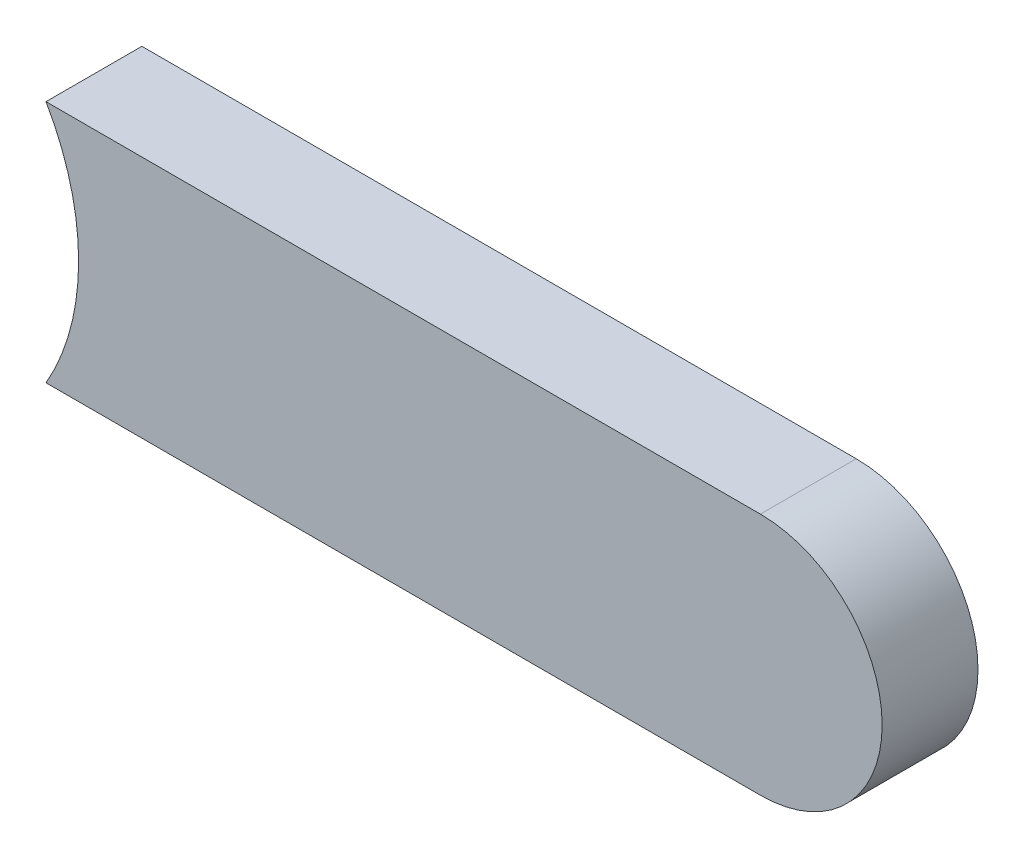
ISO-10303-21;
HEADER;
FILE_DESCRIPTION(('STEP AP214'),'2;1');
FILE_NAME('part.step','',(''),(''),'','','');
FILE_SCHEMA(('AUTOMOTIVE_DESIGN { 1 0 10303 214 1 1 1 1 }'));
ENDSEC;
DATA;
#1=APPLICATION_CONTEXT('core data for automotive mechanical design processes');
#2=APPLICATION_PROTOCOL_DEFINITION('international standard','automotive_design',2000,#1);
#3=PRODUCT_CONTEXT('',#1,'mechanical');
#4=PRODUCT('Part','Part','',(#3));
#5=PRODUCT_RELATED_PRODUCT_CATEGORY('part','',(#4));
#6=PRODUCT_DEFINITION_FORMATION('','',#4);
#7=PRODUCT_DEFINITION_CONTEXT('part definition',#1,'design');
#8=PRODUCT_DEFINITION('design','',#6,#7);
#9=PRODUCT_DEFINITION_SHAPE('','',#8);
#10=(LENGTH_UNIT() NAMED_UNIT(*) SI_UNIT(.MILLI.,.METRE.));
#11=(NAMED_UNIT(*) PLANE_ANGLE_UNIT() SI_UNIT($,.RADIAN.));
#12=(NAMED_UNIT(*) SI_UNIT($,.STERADIAN.) SOLID_ANGLE_UNIT());
#13=UNCERTAINTY_MEASURE_WITH_UNIT(LENGTH_MEASURE(1.E-05),#10,'distance_accuracy_value','');
#14=(GEOMETRIC_REPRESENTATION_CONTEXT(3) GLOBAL_UNCERTAINTY_ASSIGNED_CONTEXT((#13)) GLOBAL_UNIT_ASSIGNED_CONTEXT((#10,
#11,#12)) REPRESENTATION_CONTEXT('',''));
#15=CARTESIAN_POINT('',(0.,0.,0.));
#16=DIRECTION('',(0.,0.,1.));
#17=DIRECTION('',(1.,0.,0.));
#18=AXIS2_PLACEMENT_3D('',#15,#16,#17);
#19=CARTESIAN_POINT('',(109.024940905123,54.9005252,0.));
#20=DIRECTION('',(0.,1.,0.));
#21=DIRECTION('',(1.,0.,0.));
#22=AXIS2_PLACEMENT_3D('',#19,#20,#21);
#23=PLANE('',#22);
#24=DIRECTION('',(1.,0.,0.));
#25=VECTOR('',#24,1.);
#26=CARTESIAN_POINT('',(108.585,54.9005252,0.1999996));
#27=LINE('',#26,#25);
#28=CARTESIAN_POINT('',(109.024940905123,54.9005252,0.1999996));
#29=VERTEX_POINT('',#28);
#30=CARTESIAN_POINT('',(110.5154,54.9005252,0.1999996));
#31=VERTEX_POINT('',#30);
#32=EDGE_CURVE('E11',#29,#31,#27,.T.);
#33=ORIENTED_EDGE('',*,*,#32,.F.);
#34=DIRECTION('',(0.,0.,1.));
#35=VECTOR('',#34,1.);
#36=CARTESIAN_POINT('',(109.024940905123,54.9005252,0.));
#37=LINE('',#36,#35);
#38=CARTESIAN_POINT('',(109.024940905123,54.9005252,0.));
#39=VERTEX_POINT('',#38);
#40=EDGE_CURVE('E24',#39,#29,#37,.T.);
#41=ORIENTED_EDGE('',*,*,#40,.F.);
#42=DIRECTION('',(1.,0.,0.));
#43=VECTOR('',#42,1.);
#44=CARTESIAN_POINT('',(108.585,54.9005252,0.));
#45=LINE('',#44,#43);
#46=CARTESIAN_POINT('',(110.5154,54.9005252,0.));
#47=VERTEX_POINT('',#46);
#48=EDGE_CURVE('E82',#39,#47,#45,.T.);
#49=ORIENTED_EDGE('',*,*,#48,.T.);
#50=DIRECTION('',(0.,0.,1.));
#51=VECTOR('',#50,1.);
#52=CARTESIAN_POINT('',(110.5154,54.9005252,0.));
#53=LINE('',#52,#51);
#54=EDGE_CURVE('E37',#47,#31,#53,.T.);
#55=ORIENTED_EDGE('',*,*,#54,.T.);
#56=EDGE_LOOP('',(#33,#41,#49,#55));
#57=FACE_BOUND('',#56,.T.);
#58=ADVANCED_FACE('F17',(#57),#23,.F.);
#59=CARTESIAN_POINT('',(110.5154,55.1545252,0.));
#60=DIRECTION('',(0.,0.,-1.));
#61=DIRECTION('',(0.,-1.,0.));
#62=AXIS2_PLACEMENT_3D('',#59,#60,#61);
#63=CYLINDRICAL_SURFACE('',#62,0.253999999999998);
#64=CARTESIAN_POINT('',(110.5154,55.1545252,0.1999996));
#65=DIRECTION('',(0.,0.,1.));
#66=DIRECTION('',(0.,-1.,0.));
#67=AXIS2_PLACEMENT_3D('',#64,#65,#66);
#68=CIRCLE('',#67,0.253999999999998);
#69=CARTESIAN_POINT('',(110.5154,55.4085252,0.1999996));
#70=VERTEX_POINT('',#69);
#71=EDGE_CURVE('E97',#31,#70,#68,.T.);
#72=ORIENTED_EDGE('',*,*,#71,.F.);
#73=ORIENTED_EDGE('',*,*,#54,.F.);
#74=CARTESIAN_POINT('',(110.5154,55.1545252,0.));
#75=DIRECTION('',(0.,0.,1.));
#76=DIRECTION('',(0.,-1.,0.));
#77=AXIS2_PLACEMENT_3D('',#74,#75,#76);
#78=CIRCLE('',#77,0.253999999999998);
#79=CARTESIAN_POINT('',(110.5154,55.4085252,0.));
#80=VERTEX_POINT('',#79);
#81=EDGE_CURVE('E94',#47,#80,#78,.T.);
#82=ORIENTED_EDGE('',*,*,#81,.T.);
#83=DIRECTION('',(0.,0.,1.));
#84=VECTOR('',#83,1.);
#85=CARTESIAN_POINT('',(110.5154,55.4085252,0.));
#86=LINE('',#85,#84);
#87=EDGE_CURVE('E92',#80,#70,#86,.T.);
#88=ORIENTED_EDGE('',*,*,#87,.T.);
#89=EDGE_LOOP('',(#72,#73,#82,#88));
#90=FACE_BOUND('',#89,.T.);
#91=ADVANCED_FACE('F103',(#90),#63,.T.);
#92=CARTESIAN_POINT('',(110.5154,55.4085252,0.));
#93=DIRECTION('',(0.,-1.,0.));
#94=DIRECTION('',(-1.,0.,0.));
#95=AXIS2_PLACEMENT_3D('',#92,#93,#94);
#96=PLANE('',#95);
#97=DIRECTION('',(-1.,0.,0.));
#98=VECTOR('',#97,1.);
#99=CARTESIAN_POINT('',(110.5154,55.4085252,0.1999996));
#100=LINE('',#99,#98);
#101=CARTESIAN_POINT('',(109.024940905123,55.4085252,0.1999996));
#102=VERTEX_POINT('',#101);
#103=EDGE_CURVE('E89',#70,#102,#100,.T.);
#104=ORIENTED_EDGE('',*,*,#103,.F.);
#105=ORIENTED_EDGE('',*,*,#87,.F.);
#106=DIRECTION('',(-1.,0.,0.));
#107=VECTOR('',#106,1.);
#108=CARTESIAN_POINT('',(110.5154,55.4085252,0.));
#109=LINE('',#108,#107);
#110=CARTESIAN_POINT('',(109.024940905123,55.4085252,0.));
#111=VERTEX_POINT('',#110);
#112=EDGE_CURVE('E87',#80,#111,#109,.T.);
#113=ORIENTED_EDGE('',*,*,#112,.T.);
#114=DIRECTION('',(0.,0.,1.));
#115=VECTOR('',#114,1.);
#116=CARTESIAN_POINT('',(109.024940905123,55.4085252,0.));
#117=LINE('',#116,#115);
#118=EDGE_CURVE('E69',#111,#102,#117,.T.);
#119=ORIENTED_EDGE('',*,*,#118,.T.);
#120=EDGE_LOOP('',(#104,#105,#113,#119));
#121=FACE_BOUND('',#120,.T.);
#122=ADVANCED_FACE('F108',(#121),#96,.F.);
#123=CARTESIAN_POINT('',(108.585,55.1545252,0.));
#124=DIRECTION('',(0.,0.,-1.));
#125=DIRECTION('',(1.,0.,0.));
#126=AXIS2_PLACEMENT_3D('',#123,#124,#125);
#127=CYLINDRICAL_SURFACE('',#126,0.508);
#128=DIRECTION('',(0.,0.,1.));
#129=VECTOR('',#128,1.);
#130=CARTESIAN_POINT('',(109.093,55.1545252,0.));
#131=LINE('',#130,#129);
#132=CARTESIAN_POINT('',(109.093,55.1545252,0.));
#133=VERTEX_POINT('',#132);
#134=CARTESIAN_POINT('',(109.093,55.1545252,0.1999996));
#135=VERTEX_POINT('',#134);
#136=EDGE_CURVE('E59',#133,#135,#131,.T.);
#137=ORIENTED_EDGE('',*,*,#136,.T.);
#138=CARTESIAN_POINT('',(108.585,55.1545252,0.1999996));
#139=DIRECTION('',(0.,0.,1.));
#140=DIRECTION('',(1.,0.,0.));
#141=AXIS2_PLACEMENT_3D('',#138,#139,#140);
#142=CIRCLE('',#141,0.508);
#143=EDGE_CURVE('E70',#135,#102,#142,.T.);
#144=ORIENTED_EDGE('',*,*,#143,.T.);
#145=ORIENTED_EDGE('',*,*,#118,.F.);
#146=CARTESIAN_POINT('',(108.585,55.1545252,0.));
#147=DIRECTION('',(0.,0.,1.));
#148=DIRECTION('',(1.,0.,0.));
#149=AXIS2_PLACEMENT_3D('',#146,#147,#148);
#150=CIRCLE('',#149,0.508);
#151=EDGE_CURVE('E73',#133,#111,#150,.T.);
#152=ORIENTED_EDGE('',*,*,#151,.F.);
#153=EDGE_LOOP('',(#137,#144,#145,#152));
#154=FACE_BOUND('',#153,.T.);
#155=ADVANCED_FACE('F74',(#154),#127,.F.);
#156=CARTESIAN_POINT('',(108.585,55.1545252,0.));
#157=DIRECTION('',(0.,0.,-1.));
#158=DIRECTION('',(1.,0.,0.));
#159=AXIS2_PLACEMENT_3D('',#156,#157,#158);
#160=CYLINDRICAL_SURFACE('',#159,0.508);
#161=ORIENTED_EDGE('',*,*,#40,.T.);
#162=CARTESIAN_POINT('',(108.585,55.1545252,0.1999996));
#163=DIRECTION('',(0.,0.,1.));
#164=DIRECTION('',(1.,0.,0.));
#165=AXIS2_PLACEMENT_3D('',#162,#163,#164);
#166=CIRCLE('',#165,0.508);
#167=EDGE_CURVE('E65',#29,#135,#166,.T.);
#168=ORIENTED_EDGE('',*,*,#167,.T.);
#169=ORIENTED_EDGE('',*,*,#136,.F.);
#170=EDGE_CURVE('E63',#39,#133,#150,.T.);
#171=ORIENTED_EDGE('',*,*,#170,.F.);
#172=EDGE_LOOP('',(#161,#168,#169,#171));
#173=FACE_BOUND('',#172,.T.);
#174=ADVANCED_FACE('F61',(#173),#160,.F.);
#175=CARTESIAN_POINT('',(108.585,54.9005252,0.));
#176=DIRECTION('',(0.,0.,-1.));
#177=DIRECTION('',(-1.,0.,0.));
#178=AXIS2_PLACEMENT_3D('',#175,#176,#177);
#179=PLANE('',#178);
#180=ORIENTED_EDGE('',*,*,#48,.F.);
#181=ORIENTED_EDGE('',*,*,#170,.T.);
#182=ORIENTED_EDGE('',*,*,#151,.T.);
#183=ORIENTED_EDGE('',*,*,#112,.F.);
#184=ORIENTED_EDGE('',*,*,#81,.F.);
#185=EDGE_LOOP('',(#180,#181,#182,#183,#184));
#186=FACE_BOUND('',#185,.T.);
#187=ADVANCED_FACE('F80',(#186),#179,.T.);
#188=CARTESIAN_POINT('',(108.585,54.9005252,0.1999996));
#189=DIRECTION('',(0.,0.,-1.));
#190=DIRECTION('',(-1.,0.,0.));
#191=AXIS2_PLACEMENT_3D('',#188,#189,#190);
#192=PLANE('',#191);
#193=ORIENTED_EDGE('',*,*,#167,.F.);
#194=ORIENTED_EDGE('',*,*,#32,.T.);
#195=ORIENTED_EDGE('',*,*,#71,.T.);
#196=ORIENTED_EDGE('',*,*,#103,.T.);
#197=ORIENTED_EDGE('',*,*,#143,.F.);
#198=EDGE_LOOP('',(#193,#194,#195,#196,#197));
#199=FACE_BOUND('',#198,.T.);
#200=ADVANCED_FACE('F106',(#199),#192,.F.);
#201=CLOSED_SHELL('',(#58,#91,#122,#155,#174,#187,#200));
#202=MANIFOLD_SOLID_BREP('B1',#201);
#203=ADVANCED_BREP_SHAPE_REPRESENTATION('',(#18,#202),#14);
#204=SHAPE_DEFINITION_REPRESENTATION(#9,#203);
ENDSEC;
END-ISO-10303-21;
